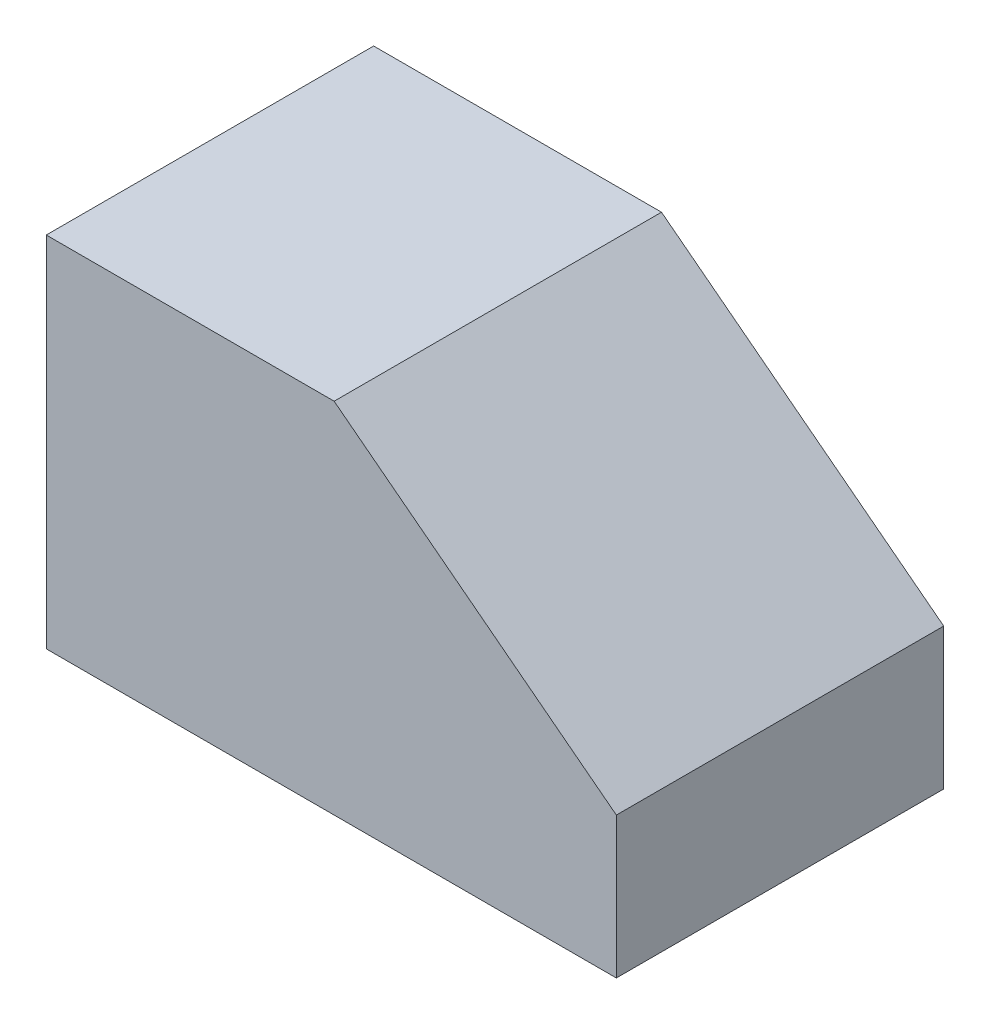
ISO-10303-21;
HEADER;
FILE_DESCRIPTION(('STEP AP214'),'2;1');
FILE_NAME('part.step','',(''),(''),'','','');
FILE_SCHEMA(('AUTOMOTIVE_DESIGN { 1 0 10303 214 1 1 1 1 }'));
ENDSEC;
DATA;
#1=APPLICATION_CONTEXT('core data for automotive mechanical design processes');
#2=APPLICATION_PROTOCOL_DEFINITION('international standard','automotive_design',2000,#1);
#3=PRODUCT_CONTEXT('',#1,'mechanical');
#4=PRODUCT('Part','Part','',(#3));
#5=PRODUCT_RELATED_PRODUCT_CATEGORY('part','',(#4));
#6=PRODUCT_DEFINITION_FORMATION('','',#4);
#7=PRODUCT_DEFINITION_CONTEXT('part definition',#1,'design');
#8=PRODUCT_DEFINITION('design','',#6,#7);
#9=PRODUCT_DEFINITION_SHAPE('','',#8);
#10=(LENGTH_UNIT() NAMED_UNIT(*) SI_UNIT(.MILLI.,.METRE.));
#11=(NAMED_UNIT(*) PLANE_ANGLE_UNIT() SI_UNIT($,.RADIAN.));
#12=(NAMED_UNIT(*) SI_UNIT($,.STERADIAN.) SOLID_ANGLE_UNIT());
#13=UNCERTAINTY_MEASURE_WITH_UNIT(LENGTH_MEASURE(1.E-05),#10,'distance_accuracy_value','');
#14=(GEOMETRIC_REPRESENTATION_CONTEXT(3) GLOBAL_UNCERTAINTY_ASSIGNED_CONTEXT((#13)) GLOBAL_UNIT_ASSIGNED_CONTEXT((#10,
#11,#12)) REPRESENTATION_CONTEXT('',''));
#15=CARTESIAN_POINT('',(0.,0.,0.));
#16=DIRECTION('',(0.,0.,1.));
#17=DIRECTION('',(1.,0.,0.));
#18=AXIS2_PLACEMENT_3D('',#15,#16,#17);
#19=CARTESIAN_POINT('',(0.,63.5,29.));
#20=DIRECTION('',(1.,0.,0.));
#21=DIRECTION('',(0.,1.,0.));
#22=AXIS2_PLACEMENT_3D('',#19,#20,#21);
#23=PLANE('',#22);
#24=DIRECTION('',(0.,-1.,0.));
#25=VECTOR('',#24,1.);
#26=CARTESIAN_POINT('',(0.,63.5,-29.));
#27=LINE('',#26,#25);
#28=CARTESIAN_POINT('',(0.,63.5,-29.));
#29=VERTEX_POINT('',#28);
#30=CARTESIAN_POINT('',(0.,0.,-29.));
#31=VERTEX_POINT('',#30);
#32=EDGE_CURVE('E107',#29,#31,#27,.T.);
#33=ORIENTED_EDGE('',*,*,#32,.T.);
#34=DIRECTION('',(0.,0.,-1.));
#35=VECTOR('',#34,1.);
#36=CARTESIAN_POINT('',(0.,0.,29.));
#37=LINE('',#36,#35);
#38=CARTESIAN_POINT('',(0.,0.,29.));
#39=VERTEX_POINT('',#38);
#40=EDGE_CURVE('E11',#39,#31,#37,.T.);
#41=ORIENTED_EDGE('',*,*,#40,.F.);
#42=DIRECTION('',(0.,-1.,0.));
#43=VECTOR('',#42,1.);
#44=CARTESIAN_POINT('',(0.,63.5,29.));
#45=LINE('',#44,#43);
#46=CARTESIAN_POINT('',(0.,63.5,29.));
#47=VERTEX_POINT('',#46);
#48=EDGE_CURVE('E115',#47,#39,#45,.T.);
#49=ORIENTED_EDGE('',*,*,#48,.F.);
#50=DIRECTION('',(0.,0.,-1.));
#51=VECTOR('',#50,1.);
#52=CARTESIAN_POINT('',(0.,63.5,29.));
#53=LINE('',#52,#51);
#54=EDGE_CURVE('E103',#47,#29,#53,.T.);
#55=ORIENTED_EDGE('',*,*,#54,.T.);
#56=EDGE_LOOP('',(#33,#41,#49,#55));
#57=FACE_BOUND('',#56,.T.);
#58=ADVANCED_FACE('F33',(#57),#23,.F.);
#59=CARTESIAN_POINT('',(0.,0.,29.));
#60=DIRECTION('',(0.,1.,0.));
#61=DIRECTION('',(0.,0.,1.));
#62=AXIS2_PLACEMENT_3D('',#59,#60,#61);
#63=PLANE('',#62);
#64=DIRECTION('',(1.,0.,0.));
#65=VECTOR('',#64,1.);
#66=CARTESIAN_POINT('',(0.,0.,-29.));
#67=LINE('',#66,#65);
#68=CARTESIAN_POINT('',(101.,0.,-29.));
#69=VERTEX_POINT('',#68);
#70=EDGE_CURVE('E110',#31,#69,#67,.T.);
#71=ORIENTED_EDGE('',*,*,#70,.T.);
#72=DIRECTION('',(0.,0.,-1.));
#73=VECTOR('',#72,1.);
#74=CARTESIAN_POINT('',(101.,0.,29.));
#75=LINE('',#74,#73);
#76=CARTESIAN_POINT('',(101.,0.,29.));
#77=VERTEX_POINT('',#76);
#78=EDGE_CURVE('E41',#77,#69,#75,.T.);
#79=ORIENTED_EDGE('',*,*,#78,.F.);
#80=DIRECTION('',(1.,0.,0.));
#81=VECTOR('',#80,1.);
#82=CARTESIAN_POINT('',(0.,0.,29.));
#83=LINE('',#82,#81);
#84=EDGE_CURVE('E83',#39,#77,#83,.T.);
#85=ORIENTED_EDGE('',*,*,#84,.F.);
#86=ORIENTED_EDGE('',*,*,#40,.T.);
#87=EDGE_LOOP('',(#71,#79,#85,#86));
#88=FACE_BOUND('',#87,.T.);
#89=ADVANCED_FACE('F134',(#88),#63,.F.);
#90=CARTESIAN_POINT('',(101.,0.,29.));
#91=DIRECTION('',(-1.,0.,0.));
#92=DIRECTION('',(0.,0.,1.));
#93=AXIS2_PLACEMENT_3D('',#90,#91,#92);
#94=PLANE('',#93);
#95=DIRECTION('',(0.,1.,0.));
#96=VECTOR('',#95,1.);
#97=CARTESIAN_POINT('',(101.,0.,-29.));
#98=LINE('',#97,#96);
#99=CARTESIAN_POINT('',(101.,25.,-29.));
#100=VERTEX_POINT('',#99);
#101=EDGE_CURVE('E98',#69,#100,#98,.T.);
#102=ORIENTED_EDGE('',*,*,#101,.T.);
#103=DIRECTION('',(0.,0.,-1.));
#104=VECTOR('',#103,1.);
#105=CARTESIAN_POINT('',(101.,25.,29.));
#106=LINE('',#105,#104);
#107=CARTESIAN_POINT('',(101.,25.,29.));
#108=VERTEX_POINT('',#107);
#109=EDGE_CURVE('E95',#108,#100,#106,.T.);
#110=ORIENTED_EDGE('',*,*,#109,.F.);
#111=DIRECTION('',(0.,1.,0.));
#112=VECTOR('',#111,1.);
#113=CARTESIAN_POINT('',(101.,0.,29.));
#114=LINE('',#113,#112);
#115=EDGE_CURVE('E87',#77,#108,#114,.T.);
#116=ORIENTED_EDGE('',*,*,#115,.F.);
#117=ORIENTED_EDGE('',*,*,#78,.T.);
#118=EDGE_LOOP('',(#102,#110,#116,#117));
#119=FACE_BOUND('',#118,.T.);
#120=ADVANCED_FACE('F96',(#119),#94,.F.);
#121=CARTESIAN_POINT('',(101.,25.,29.));
#122=DIRECTION('',(-0.610093599798248,-0.792329350387335,0.));
#123=DIRECTION('',(0.792329350387335,-0.610093599798248,0.));
#124=AXIS2_PLACEMENT_3D('',#121,#122,#123);
#125=PLANE('',#124);
#126=DIRECTION('',(-0.792329350387335,0.610093599798248,0.));
#127=VECTOR('',#126,1.);
#128=CARTESIAN_POINT('',(101.,25.,-29.));
#129=LINE('',#128,#127);
#130=CARTESIAN_POINT('',(51.,63.5,-29.));
#131=VERTEX_POINT('',#130);
#132=EDGE_CURVE('E69',#100,#131,#129,.T.);
#133=ORIENTED_EDGE('',*,*,#132,.T.);
#134=DIRECTION('',(0.,0.,-1.));
#135=VECTOR('',#134,1.);
#136=CARTESIAN_POINT('',(51.,63.5,29.));
#137=LINE('',#136,#135);
#138=CARTESIAN_POINT('',(51.,63.5,29.));
#139=VERTEX_POINT('',#138);
#140=EDGE_CURVE('E99',#139,#131,#137,.T.);
#141=ORIENTED_EDGE('',*,*,#140,.F.);
#142=DIRECTION('',(-0.792329350387335,0.610093599798248,0.));
#143=VECTOR('',#142,1.);
#144=CARTESIAN_POINT('',(101.,25.,29.));
#145=LINE('',#144,#143);
#146=EDGE_CURVE('E91',#108,#139,#145,.T.);
#147=ORIENTED_EDGE('',*,*,#146,.F.);
#148=ORIENTED_EDGE('',*,*,#109,.T.);
#149=EDGE_LOOP('',(#133,#141,#147,#148));
#150=FACE_BOUND('',#149,.T.);
#151=ADVANCED_FACE('F101',(#150),#125,.F.);
#152=CARTESIAN_POINT('',(51.,63.5,29.));
#153=DIRECTION('',(0.,-1.,0.));
#154=DIRECTION('',(1.,0.,0.));
#155=AXIS2_PLACEMENT_3D('',#152,#153,#154);
#156=PLANE('',#155);
#157=DIRECTION('',(-1.,0.,0.));
#158=VECTOR('',#157,1.);
#159=CARTESIAN_POINT('',(51.,63.5,-29.));
#160=LINE('',#159,#158);
#161=EDGE_CURVE('E75',#131,#29,#160,.T.);
#162=ORIENTED_EDGE('',*,*,#161,.T.);
#163=ORIENTED_EDGE('',*,*,#54,.F.);
#164=DIRECTION('',(-1.,0.,0.));
#165=VECTOR('',#164,1.);
#166=CARTESIAN_POINT('',(51.,63.5,29.));
#167=LINE('',#166,#165);
#168=EDGE_CURVE('E49',#139,#47,#167,.T.);
#169=ORIENTED_EDGE('',*,*,#168,.F.);
#170=ORIENTED_EDGE('',*,*,#140,.T.);
#171=EDGE_LOOP('',(#162,#163,#169,#170));
#172=FACE_BOUND('',#171,.T.);
#173=ADVANCED_FACE('F123',(#172),#156,.F.);
#174=CARTESIAN_POINT('',(0.,0.,29.));
#175=DIRECTION('',(0.,0.,1.));
#176=DIRECTION('',(1.,0.,0.));
#177=AXIS2_PLACEMENT_3D('',#174,#175,#176);
#178=PLANE('',#177);
#179=ORIENTED_EDGE('',*,*,#48,.T.);
#180=ORIENTED_EDGE('',*,*,#84,.T.);
#181=ORIENTED_EDGE('',*,*,#115,.T.);
#182=ORIENTED_EDGE('',*,*,#146,.T.);
#183=ORIENTED_EDGE('',*,*,#168,.T.);
#184=EDGE_LOOP('',(#179,#180,#181,#182,#183));
#185=FACE_BOUND('',#184,.T.);
#186=ADVANCED_FACE('F89',(#185),#178,.T.);
#187=CARTESIAN_POINT('',(0.,0.,-29.));
#188=DIRECTION('',(0.,0.,1.));
#189=DIRECTION('',(1.,0.,0.));
#190=AXIS2_PLACEMENT_3D('',#187,#188,#189);
#191=PLANE('',#190);
#192=ORIENTED_EDGE('',*,*,#32,.F.);
#193=ORIENTED_EDGE('',*,*,#161,.F.);
#194=ORIENTED_EDGE('',*,*,#132,.F.);
#195=ORIENTED_EDGE('',*,*,#101,.F.);
#196=ORIENTED_EDGE('',*,*,#70,.F.);
#197=EDGE_LOOP('',(#192,#193,#194,#195,#196));
#198=FACE_BOUND('',#197,.T.);
#199=ADVANCED_FACE('F119',(#198),#191,.F.);
#200=CLOSED_SHELL('',(#58,#89,#120,#151,#173,#186,#199));
#201=MANIFOLD_SOLID_BREP('B2',#200);
#202=ADVANCED_BREP_SHAPE_REPRESENTATION('',(#18,#201),#14);
#203=SHAPE_DEFINITION_REPRESENTATION(#9,#202);
ENDSEC;
END-ISO-10303-21;
